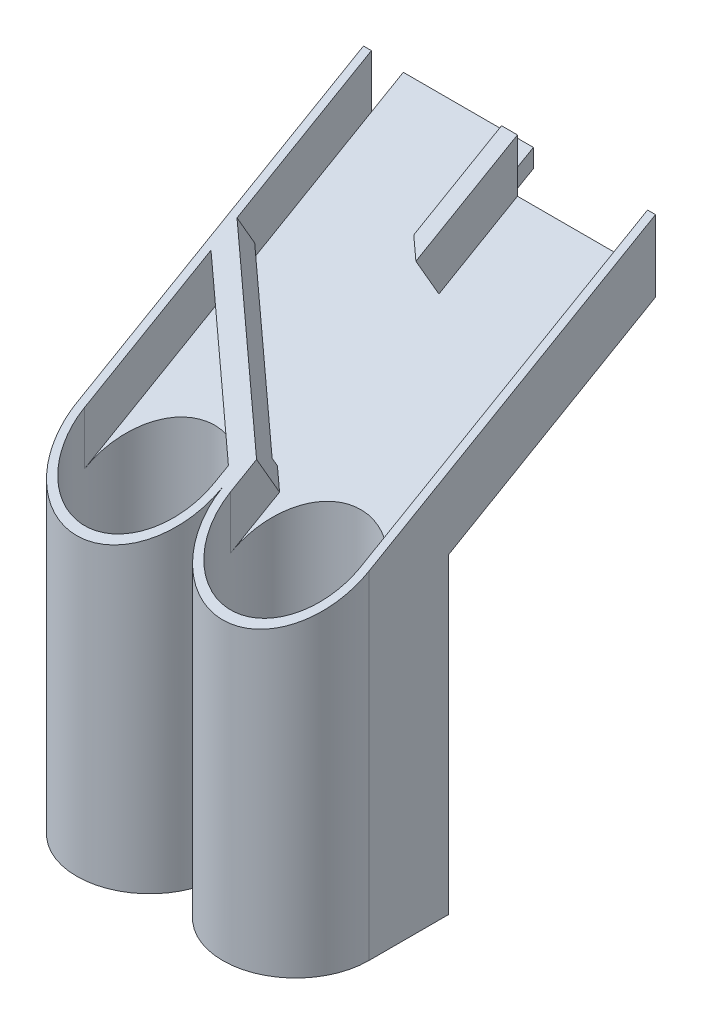
ISO-10303-21;
HEADER;
FILE_DESCRIPTION(('STEP AP214'),'2;1');
FILE_NAME('part.step','',(''),(''),'','','');
FILE_SCHEMA(('AUTOMOTIVE_DESIGN { 1 0 10303 214 1 1 1 1 }'));
ENDSEC;
DATA;
#1=APPLICATION_CONTEXT('core data for automotive mechanical design processes');
#2=APPLICATION_PROTOCOL_DEFINITION('international standard','automotive_design',2000,#1);
#3=PRODUCT_CONTEXT('',#1,'mechanical');
#4=PRODUCT('Part','Part','',(#3));
#5=PRODUCT_RELATED_PRODUCT_CATEGORY('part','',(#4));
#6=PRODUCT_DEFINITION_FORMATION('','',#4);
#7=PRODUCT_DEFINITION_CONTEXT('part definition',#1,'design');
#8=PRODUCT_DEFINITION('design','',#6,#7);
#9=PRODUCT_DEFINITION_SHAPE('','',#8);
#10=(LENGTH_UNIT() NAMED_UNIT(*) SI_UNIT(.MILLI.,.METRE.));
#11=(NAMED_UNIT(*) PLANE_ANGLE_UNIT() SI_UNIT($,.RADIAN.));
#12=(NAMED_UNIT(*) SI_UNIT($,.STERADIAN.) SOLID_ANGLE_UNIT());
#13=UNCERTAINTY_MEASURE_WITH_UNIT(LENGTH_MEASURE(1.E-05),#10,'distance_accuracy_value','');
#14=(GEOMETRIC_REPRESENTATION_CONTEXT(3) GLOBAL_UNCERTAINTY_ASSIGNED_CONTEXT((#13)) GLOBAL_UNIT_ASSIGNED_CONTEXT((#10,
#11,#12)) REPRESENTATION_CONTEXT('',''));
#15=CARTESIAN_POINT('',(0.,0.,0.));
#16=DIRECTION('',(0.,0.,1.));
#17=DIRECTION('',(1.,0.,0.));
#18=AXIS2_PLACEMENT_3D('',#15,#16,#17);
#19=CARTESIAN_POINT('',(0.,300.,0.));
#20=DIRECTION('',(0.,-1.,0.));
#21=DIRECTION('',(0.,0.,-1.));
#22=AXIS2_PLACEMENT_3D('',#19,#20,#21);
#23=CYLINDRICAL_SURFACE('',#22,24.5);
#24=CARTESIAN_POINT('',(0.,230.717967697246,0.));
#25=DIRECTION('',(0.,-0.866025403784442,-0.499999999999995));
#26=DIRECTION('',(0.,-0.499999999999995,0.866025403784442));
#27=AXIS2_PLACEMENT_3D('',#24,#25,#26);
#28=ELLIPSE('',#27,28.2901631902916,24.5);
#29=CARTESIAN_POINT('',(24.5,230.717967697246,0.));
#30=VERTEX_POINT('',#29);
#31=CARTESIAN_POINT('',(-24.5,230.717967697246,0.));
#32=VERTEX_POINT('',#31);
#33=EDGE_CURVE('E407',#30,#32,#28,.F.);
#34=ORIENTED_EDGE('',*,*,#33,.T.);
#35=DIRECTION('',(0.,-1.,0.));
#36=VECTOR('',#35,1.);
#37=CARTESIAN_POINT('',(-24.5,250.717967697253,-1.20181642415673E-11));
#38=LINE('',#37,#36);
#39=CARTESIAN_POINT('',(-24.5,250.717967697253,-1.20181642415673E-11));
#40=VERTEX_POINT('',#39);
#41=EDGE_CURVE('E390',#40,#32,#38,.T.);
#42=ORIENTED_EDGE('',*,*,#41,.F.);
#43=CARTESIAN_POINT('',(24.5,250.717967697274,0.));
#44=CARTESIAN_POINT('',(24.5,222.427804506982,49.));
#45=CARTESIAN_POINT('',(-24.5,222.427804506982,49.));
#46=CARTESIAN_POINT('',(-24.5,250.717967697274,0.));
#47=(BOUNDED_CURVE() B_SPLINE_CURVE(3,(#43,#44,#45,#46),.UNSPECIFIED.,.F.,
.F.) B_SPLINE_CURVE_WITH_KNOTS((4,4),(0.,1.),
.UNSPECIFIED.) CURVE() GEOMETRIC_REPRESENTATION_ITEM() RATIONAL_B_SPLINE_CURVE((1.,
0.333333333333333,0.333333333333333,1.)) REPRESENTATION_ITEM(''));
#48=CARTESIAN_POINT('',(24.5,250.717967697274,0.));
#49=VERTEX_POINT('',#48);
#50=EDGE_CURVE('E380',#49,#40,#47,.T.);
#51=ORIENTED_EDGE('',*,*,#50,.F.);
#52=DIRECTION('',(0.,-1.,0.));
#53=VECTOR('',#52,1.);
#54=CARTESIAN_POINT('',(24.5,250.717967697274,0.));
#55=LINE('',#54,#53);
#56=EDGE_CURVE('E398',#49,#30,#55,.T.);
#57=ORIENTED_EDGE('',*,*,#56,.T.);
#58=EDGE_LOOP('',(#34,#42,#51,#57));
#59=FACE_BOUND('',#58,.T.);
#60=CARTESIAN_POINT('',(0.,167.717967697246,0.));
#61=DIRECTION('',(0.,-1.,0.));
#62=DIRECTION('',(0.,0.,-1.));
#63=AXIS2_PLACEMENT_3D('',#60,#61,#62);
#64=CIRCLE('',#63,24.5);
#65=CARTESIAN_POINT('',(0.,167.717967697246,-24.5));
#66=VERTEX_POINT('',#65);
#67=EDGE_CURVE('E243',#66,#66,#64,.T.);
#68=ORIENTED_EDGE('',*,*,#67,.T.);
#69=EDGE_LOOP('',(#68));
#70=FACE_BOUND('',#69,.T.);
#71=ADVANCED_FACE('F36',(#59,#70),#23,.F.);
#72=CARTESIAN_POINT('',(24.5,320.,-120.));
#73=DIRECTION('',(1.,0.,0.));
#74=DIRECTION('',(0.,0.,-1.));
#75=AXIS2_PLACEMENT_3D('',#72,#73,#74);
#76=PLANE('',#75);
#77=DIRECTION('',(0.,0.499999999999995,-0.866025403784442));
#78=VECTOR('',#77,1.);
#79=CARTESIAN_POINT('',(24.5,242.147344788948,-11.7962618216929));
#80=LINE('',#79,#78);
#81=CARTESIAN_POINT('',(24.5,242.147344788948,-11.7962618216929));
#82=VERTEX_POINT('',#81);
#83=CARTESIAN_POINT('',(24.5,247.804199038441,-21.5942207928257));
#84=VERTEX_POINT('',#83);
#85=EDGE_CURVE('E271',#82,#84,#80,.T.);
#86=ORIENTED_EDGE('',*,*,#85,.T.);
#87=DIRECTION('',(0.,0.866025403784442,0.499999999999995));
#88=VECTOR('',#87,1.);
#89=CARTESIAN_POINT('',(24.5,178.924746159196,-61.3617914542915));
#90=LINE('',#89,#88);
#91=CARTESIAN_POINT('',(24.5,244.340097423303,-23.5942207928257));
#92=VERTEX_POINT('',#91);
#93=EDGE_CURVE('E264',#92,#84,#90,.T.);
#94=ORIENTED_EDGE('',*,*,#93,.F.);
#95=DIRECTION('',(0.,-0.499999999999995,0.866025403784442));
#96=VECTOR('',#95,1.);
#97=CARTESIAN_POINT('',(24.5,300.,-120.));
#98=LINE('',#97,#96);
#99=EDGE_CURVE('E364',#92,#30,#98,.T.);
#100=ORIENTED_EDGE('',*,*,#99,.T.);
#101=ORIENTED_EDGE('',*,*,#56,.F.);
#102=DIRECTION('',(0.,-0.499999999999995,0.866025403784442));
#103=VECTOR('',#102,1.);
#104=CARTESIAN_POINT('',(24.5,320.,-120.));
#105=LINE('',#104,#103);
#106=CARTESIAN_POINT('',(24.5,253.683243173821,-5.13600778384251));
#107=VERTEX_POINT('',#106);
#108=EDGE_CURVE('E373',#107,#49,#105,.T.);
#109=ORIENTED_EDGE('',*,*,#108,.F.);
#110=DIRECTION('',(0.,0.866025403784442,0.499999999999995));
#111=VECTOR('',#110,1.);
#112=CARTESIAN_POINT('',(24.5,171.384969981436,-52.6509379653067));
#113=LINE('',#112,#111);
#114=EDGE_CURVE('E279',#82,#107,#113,.T.);
#115=ORIENTED_EDGE('',*,*,#114,.F.);
#116=EDGE_LOOP('',(#86,#94,#100,#101,#109,#115));
#117=FACE_BOUND('',#116,.T.);
#118=ADVANCED_FACE('F499',(#117),#76,.F.);
#119=CARTESIAN_POINT('',(0.,234.840835294559,27.5));
#120=DIRECTION('',(0.,0.866025403784442,0.499999999999995));
#121=DIRECTION('',(0.,-0.499999999999995,0.866025403784442));
#122=AXIS2_PLACEMENT_3D('',#119,#120,#121);
#123=PLANE('',#122);
#124=DIRECTION('',(0.,-0.499999999999995,0.866025403784442));
#125=VECTOR('',#124,1.);
#126=CARTESIAN_POINT('',(30.5,320.,-120.));
#127=LINE('',#126,#125);
#128=CARTESIAN_POINT('',(30.5,256.340097423324,-9.73781433226267));
#129=VERTEX_POINT('',#128);
#130=CARTESIAN_POINT('',(30.5,250.717967697274,0.));
#131=VERTEX_POINT('',#130);
#132=EDGE_CURVE('E310',#129,#131,#127,.T.);
#133=ORIENTED_EDGE('',*,*,#132,.F.);
#134=DIRECTION('',(-0.707106781186544,0.353553390593272,-0.6123724356958));
#135=VECTOR('',#134,1.);
#136=CARTESIAN_POINT('',(-24.5,283.840097423324,-57.3692115404074));
#137=LINE('',#136,#135);
#138=CARTESIAN_POINT('',(-24.5,283.840097423303,-57.3692115404193));
#139=VERTEX_POINT('',#138);
#140=EDGE_CURVE('E269',#129,#139,#137,.T.);
#141=ORIENTED_EDGE('',*,*,#140,.T.);
#142=DIRECTION('',(0.,0.499999999999995,-0.866025403784442));
#143=VECTOR('',#142,1.);
#144=CARTESIAN_POINT('',(-24.5,320.,-120.));
#145=LINE('',#144,#143);
#146=CARTESIAN_POINT('',(-24.5,313.071796769752,-108.));
#147=VERTEX_POINT('',#146);
#148=EDGE_CURVE('E384',#139,#147,#145,.T.);
#149=ORIENTED_EDGE('',*,*,#148,.T.);
#150=DIRECTION('',(-1.,0.,0.));
#151=VECTOR('',#150,1.);
#152=CARTESIAN_POINT('',(0.,313.071796769752,-108.));
#153=LINE('',#152,#151);
#154=CARTESIAN_POINT('',(-27.5,313.071796769732,-108.000000000012));
#155=VERTEX_POINT('',#154);
#156=EDGE_CURVE('E44',#147,#155,#153,.T.);
#157=ORIENTED_EDGE('',*,*,#156,.T.);
#158=DIRECTION('',(0.,-0.499999999999995,0.866025403784442));
#159=VECTOR('',#158,1.);
#160=CARTESIAN_POINT('',(-27.5,320.,-120.));
#161=LINE('',#160,#159);
#162=CARTESIAN_POINT('',(-27.5,250.717967697274,0.));
#163=VERTEX_POINT('',#162);
#164=EDGE_CURVE('E365',#155,#163,#161,.T.);
#165=ORIENTED_EDGE('',*,*,#164,.T.);
#166=CARTESIAN_POINT('',(27.5,250.717967697274,0.));
#167=CARTESIAN_POINT('',(27.5,218.963702891845,55.));
#168=CARTESIAN_POINT('',(-27.5,218.963702891845,55.));
#169=CARTESIAN_POINT('',(-27.5,250.717967697274,0.));
#170=(BOUNDED_CURVE() B_SPLINE_CURVE(3,(#166,#167,#168,#169),.UNSPECIFIED.,.F.,
.F.) B_SPLINE_CURVE_WITH_KNOTS((4,4),(0.,1.),
.UNSPECIFIED.) CURVE() GEOMETRIC_REPRESENTATION_ITEM() RATIONAL_B_SPLINE_CURVE((1.,
0.333333333333333,0.333333333333333,1.)) REPRESENTATION_ITEM(''));
#171=CARTESIAN_POINT('',(27.5,250.717967697253,-1.20597976049908E-11));
#172=VERTEX_POINT('',#171);
#173=EDGE_CURVE('E367',#172,#163,#170,.T.);
#174=ORIENTED_EDGE('',*,*,#173,.F.);
#175=CARTESIAN_POINT('',(27.5,250.717967697274,0.));
#176=CARTESIAN_POINT('',(27.5,218.963702891845,55.));
#177=CARTESIAN_POINT('',(82.5,218.963702891845,55.));
#178=CARTESIAN_POINT('',(82.5,250.717967697274,0.));
#179=(BOUNDED_CURVE() B_SPLINE_CURVE(3,(#175,#176,#177,#178),.UNSPECIFIED.,.F.,
.F.) B_SPLINE_CURVE_WITH_KNOTS((4,4),(0.,1.),
.UNSPECIFIED.) CURVE() GEOMETRIC_REPRESENTATION_ITEM() RATIONAL_B_SPLINE_CURVE((1.,
0.333333333333333,0.333333333333333,1.)) REPRESENTATION_ITEM(''));
#180=CARTESIAN_POINT('',(82.5,250.717967697274,0.));
#181=VERTEX_POINT('',#180);
#182=EDGE_CURVE('E305',#172,#181,#179,.T.);
#183=ORIENTED_EDGE('',*,*,#182,.T.);
#184=DIRECTION('',(0.,-0.499999999999995,0.866025403784442));
#185=VECTOR('',#184,1.);
#186=CARTESIAN_POINT('',(82.5,320.,-120.));
#187=LINE('',#186,#185);
#188=CARTESIAN_POINT('',(82.5,313.071796769732,-108.000000000012));
#189=VERTEX_POINT('',#188);
#190=EDGE_CURVE('E302',#189,#181,#187,.T.);
#191=ORIENTED_EDGE('',*,*,#190,.F.);
#192=DIRECTION('',(1.,0.,0.));
#193=VECTOR('',#192,1.);
#194=CARTESIAN_POINT('',(55.,313.071796769752,-108.));
#195=LINE('',#194,#193);
#196=CARTESIAN_POINT('',(79.5,313.071796769752,-108.));
#197=VERTEX_POINT('',#196);
#198=EDGE_CURVE('E345',#197,#189,#195,.T.);
#199=ORIENTED_EDGE('',*,*,#198,.F.);
#200=DIRECTION('',(0.,0.499999999999995,-0.866025403784442));
#201=VECTOR('',#200,1.);
#202=CARTESIAN_POINT('',(79.5,320.,-120.));
#203=LINE('',#202,#201);
#204=CARTESIAN_POINT('',(79.5,250.717967697253,-1.20181642415673E-11));
#205=VERTEX_POINT('',#204);
#206=EDGE_CURVE('E321',#205,#197,#203,.T.);
#207=ORIENTED_EDGE('',*,*,#206,.F.);
#208=CARTESIAN_POINT('',(30.5,250.717967697274,0.));
#209=CARTESIAN_POINT('',(30.5,222.427804506982,49.));
#210=CARTESIAN_POINT('',(79.5,222.427804506982,49.));
#211=CARTESIAN_POINT('',(79.5,250.717967697274,0.));
#212=(BOUNDED_CURVE() B_SPLINE_CURVE(3,(#208,#209,#210,#211),.UNSPECIFIED.,.F.,
.F.) B_SPLINE_CURVE_WITH_KNOTS((4,4),(0.,1.),
.UNSPECIFIED.) CURVE() GEOMETRIC_REPRESENTATION_ITEM() RATIONAL_B_SPLINE_CURVE((1.,
0.333333333333333,0.333333333333333,1.)) REPRESENTATION_ITEM(''));
#213=EDGE_CURVE('E317',#131,#205,#212,.T.);
#214=ORIENTED_EDGE('',*,*,#213,.F.);
#215=EDGE_LOOP('',(#133,#141,#149,#157,#165,#174,#183,#191,#199,#207,#214));
#216=FACE_BOUND('',#215,.T.);
#217=CARTESIAN_POINT('',(-24.5,278.183243173832,-47.5712525692746));
#218=VERTEX_POINT('',#217);
#219=EDGE_CURVE('E385',#40,#218,#145,.T.);
#220=ORIENTED_EDGE('',*,*,#219,.T.);
#221=DIRECTION('',(0.707106781186544,-0.353553390593273,0.6123724356958));
#222=VECTOR('',#221,1.);
#223=CARTESIAN_POINT('',(-24.5,278.183243173832,-47.5712525692746));
#224=LINE('',#223,#222);
#225=EDGE_CURVE('E59',#218,#107,#224,.T.);
#226=ORIENTED_EDGE('',*,*,#225,.T.);
#227=ORIENTED_EDGE('',*,*,#108,.T.);
#228=ORIENTED_EDGE('',*,*,#50,.T.);
#229=EDGE_LOOP('',(#220,#226,#227,#228));
#230=FACE_BOUND('',#229,.T.);
#231=ADVANCED_FACE('F416',(#216,#230),#123,.T.);
#232=CARTESIAN_POINT('',(30.5,320.,-120.));
#233=DIRECTION('',(-1.,0.,0.));
#234=DIRECTION('',(0.,0.,-1.));
#235=AXIS2_PLACEMENT_3D('',#232,#233,#234);
#236=PLANE('',#235);
#237=DIRECTION('',(0.,-0.499999999999995,0.866025403784442));
#238=VECTOR('',#237,1.);
#239=CARTESIAN_POINT('',(30.5,300.,-120.));
#240=LINE('',#239,#238);
#241=CARTESIAN_POINT('',(30.5,241.340097423303,-18.3980683701191));
#242=VERTEX_POINT('',#241);
#243=CARTESIAN_POINT('',(30.5,230.717967697246,0.));
#244=VERTEX_POINT('',#243);
#245=EDGE_CURVE('E299',#242,#244,#240,.T.);
#246=ORIENTED_EDGE('',*,*,#245,.F.);
#247=DIRECTION('',(0.,0.866025403784442,0.499999999999995));
#248=VECTOR('',#247,1.);
#249=CARTESIAN_POINT('',(30.5,175.924746159196,-56.1656390315849));
#250=LINE('',#249,#248);
#251=EDGE_CURVE('E256',#242,#129,#250,.T.);
#252=ORIENTED_EDGE('',*,*,#251,.T.);
#253=ORIENTED_EDGE('',*,*,#132,.T.);
#254=DIRECTION('',(0.,-1.,0.));
#255=VECTOR('',#254,1.);
#256=CARTESIAN_POINT('',(30.5,250.717967697274,0.));
#257=LINE('',#256,#255);
#258=EDGE_CURVE('E334',#131,#244,#257,.T.);
#259=ORIENTED_EDGE('',*,*,#258,.T.);
#260=EDGE_LOOP('',(#246,#252,#253,#259));
#261=FACE_BOUND('',#260,.T.);
#262=ADVANCED_FACE('F456',(#261),#236,.F.);
#263=CARTESIAN_POINT('',(-27.5,300.,-120.));
#264=DIRECTION('',(0.,0.,1.));
#265=DIRECTION('',(1.,0.,0.));
#266=AXIS2_PLACEMENT_3D('',#263,#264,#265);
#267=PLANE('',#266);
#268=DIRECTION('',(0.,-1.,0.));
#269=VECTOR('',#268,1.);
#270=CARTESIAN_POINT('',(24.5,320.,-120.));
#271=LINE('',#270,#269);
#272=CARTESIAN_POINT('',(24.5,300.,-120.));
#273=VERTEX_POINT('',#272);
#274=CARTESIAN_POINT('',(24.5,293.071796769724,-120.));
#275=VERTEX_POINT('',#274);
#276=EDGE_CURVE('E352',#273,#275,#271,.T.);
#277=ORIENTED_EDGE('',*,*,#276,.T.);
#278=DIRECTION('',(1.,0.,0.));
#279=VECTOR('',#278,1.);
#280=CARTESIAN_POINT('',(-27.5,293.071796769724,-120.));
#281=LINE('',#280,#279);
#282=CARTESIAN_POINT('',(-24.5,293.071796769724,-120.));
#283=VERTEX_POINT('',#282);
#284=EDGE_CURVE('E211',#283,#275,#281,.T.);
#285=ORIENTED_EDGE('',*,*,#284,.F.);
#286=DIRECTION('',(0.,-1.,0.));
#287=VECTOR('',#286,1.);
#288=CARTESIAN_POINT('',(-24.5,320.,-120.));
#289=LINE('',#288,#287);
#290=CARTESIAN_POINT('',(-24.5,300.,-120.));
#291=VERTEX_POINT('',#290);
#292=EDGE_CURVE('E348',#291,#283,#289,.T.);
#293=ORIENTED_EDGE('',*,*,#292,.F.);
#294=DIRECTION('',(-1.,0.,0.));
#295=VECTOR('',#294,1.);
#296=CARTESIAN_POINT('',(-27.5,300.,-120.));
#297=LINE('',#296,#295);
#298=EDGE_CURVE('E401',#273,#291,#297,.T.);
#299=ORIENTED_EDGE('',*,*,#298,.F.);
#300=EDGE_LOOP('',(#277,#285,#293,#299));
#301=FACE_BOUND('',#300,.T.);
#302=ADVANCED_FACE('F487',(#301),#267,.F.);
#303=CARTESIAN_POINT('',(-27.5,300.,0.));
#304=DIRECTION('',(1.,0.,0.));
#305=DIRECTION('',(0.,0.,-1.));
#306=AXIS2_PLACEMENT_3D('',#303,#304,#305);
#307=PLANE('',#306);
#308=DIRECTION('',(0.,-0.5,0.866025403784438));
#309=VECTOR('',#308,1.);
#310=CARTESIAN_POINT('',(-27.5,241.110272542658,-30.));
#311=LINE('',#310,#309);
#312=CARTESIAN_POINT('',(-27.5,286.143593539449,-108.));
#313=VERTEX_POINT('',#312);
#314=CARTESIAN_POINT('',(-27.5,241.110272542658,-30.));
#315=VERTEX_POINT('',#314);
#316=EDGE_CURVE('E206',#313,#315,#311,.T.);
#317=ORIENTED_EDGE('',*,*,#316,.T.);
#318=DIRECTION('',(0.,-1.,0.));
#319=VECTOR('',#318,1.);
#320=CARTESIAN_POINT('',(-27.5,123.717967697246,-30.));
#321=LINE('',#320,#319);
#322=CARTESIAN_POINT('',(-27.5,123.717967697246,-30.));
#323=VERTEX_POINT('',#322);
#324=EDGE_CURVE('E214',#315,#323,#321,.T.);
#325=ORIENTED_EDGE('',*,*,#324,.T.);
#326=DIRECTION('',(0.,0.,-1.));
#327=VECTOR('',#326,1.);
#328=CARTESIAN_POINT('',(-27.5,123.717967697246,0.));
#329=LINE('',#328,#327);
#330=CARTESIAN_POINT('',(-27.5,123.717967697246,0.));
#331=VERTEX_POINT('',#330);
#332=EDGE_CURVE('E241',#331,#323,#329,.T.);
#333=ORIENTED_EDGE('',*,*,#332,.F.);
#334=DIRECTION('',(0.,-1.,0.));
#335=VECTOR('',#334,1.);
#336=CARTESIAN_POINT('',(-27.5,300.,0.));
#337=LINE('',#336,#335);
#338=EDGE_CURVE('E404',#163,#331,#337,.T.);
#339=ORIENTED_EDGE('',*,*,#338,.F.);
#340=ORIENTED_EDGE('',*,*,#164,.F.);
#341=DIRECTION('',(0.,-1.,0.));
#342=VECTOR('',#341,1.);
#343=CARTESIAN_POINT('',(-27.5,320.,-108.));
#344=LINE('',#343,#342);
#345=EDGE_CURVE('E223',#155,#313,#344,.T.);
#346=ORIENTED_EDGE('',*,*,#345,.T.);
#347=EDGE_LOOP('',(#317,#325,#333,#339,#340,#346));
#348=FACE_BOUND('',#347,.T.);
#349=ADVANCED_FACE('F221',(#348),#307,.F.);
#350=CARTESIAN_POINT('',(24.5,293.071796769725,-108.));
#351=VERTEX_POINT('',#350);
#352=CARTESIAN_POINT('',(24.5,278.988329701443,-83.6067194910137));
#353=VERTEX_POINT('',#352);
#354=EDGE_CURVE('E393',#351,#353,#98,.T.);
#355=ORIENTED_EDGE('',*,*,#354,.T.);
#356=DIRECTION('',(0.,0.866025403784442,0.499999999999995));
#357=VECTOR('',#356,1.);
#358=CARTESIAN_POINT('',(24.5,213.572978437336,-121.37429015248));
#359=LINE('',#358,#357);
#360=CARTESIAN_POINT('',(24.5,293.988329701464,-74.9464654531573));
#361=VERTEX_POINT('',#360);
#362=EDGE_CURVE('E260',#353,#361,#359,.T.);
#363=ORIENTED_EDGE('',*,*,#362,.T.);
#364=CARTESIAN_POINT('',(24.5,313.071796769732,-108.000000000012));
#365=VERTEX_POINT('',#364);
#366=EDGE_CURVE('E374',#365,#361,#105,.T.);
#367=ORIENTED_EDGE('',*,*,#366,.F.);
#368=DIRECTION('',(0.,-1.,0.));
#369=VECTOR('',#368,1.);
#370=CARTESIAN_POINT('',(24.5,320.,-108.));
#371=LINE('',#370,#369);
#372=EDGE_CURVE('E360',#365,#351,#371,.T.);
#373=ORIENTED_EDGE('',*,*,#372,.T.);
#374=EDGE_LOOP('',(#355,#363,#367,#373));
#375=FACE_BOUND('',#374,.T.);
#376=ADVANCED_FACE('F468',(#375),#76,.F.);
#377=CARTESIAN_POINT('',(-24.5,320.,-120.));
#378=DIRECTION('',(-1.,0.,0.));
#379=DIRECTION('',(0.,0.,1.));
#380=AXIS2_PLACEMENT_3D('',#377,#378,#379);
#381=PLANE('',#380);
#382=ORIENTED_EDGE('',*,*,#148,.F.);
#383=DIRECTION('',(0.,0.866025403784442,0.499999999999995));
#384=VECTOR('',#383,1.);
#385=CARTESIAN_POINT('',(-24.5,201.541824230929,-104.884141721878));
#386=LINE('',#385,#384);
#387=CARTESIAN_POINT('',(-24.5,272.304199038441,-64.0294655782638));
#388=VERTEX_POINT('',#387);
#389=EDGE_CURVE('E284',#388,#139,#386,.T.);
#390=ORIENTED_EDGE('',*,*,#389,.F.);
#391=DIRECTION('',(0.,-0.499999999999995,0.866025403784442));
#392=VECTOR('',#391,1.);
#393=CARTESIAN_POINT('',(-24.5,272.304199038441,-64.0294655782638));
#394=LINE('',#393,#392);
#395=CARTESIAN_POINT('',(-24.5,266.647344788948,-54.231506607131));
#396=VERTEX_POINT('',#395);
#397=EDGE_CURVE('E281',#388,#396,#394,.T.);
#398=ORIENTED_EDGE('',*,*,#397,.T.);
#399=DIRECTION('',(0.,0.866025403784442,0.499999999999995));
#400=VECTOR('',#399,1.);
#401=CARTESIAN_POINT('',(-24.5,195.884969981436,-95.0861827507448));
#402=LINE('',#401,#400);
#403=EDGE_CURVE('E280',#396,#218,#402,.T.);
#404=ORIENTED_EDGE('',*,*,#403,.T.);
#405=ORIENTED_EDGE('',*,*,#219,.F.);
#406=ORIENTED_EDGE('',*,*,#41,.T.);
#407=DIRECTION('',(0.,0.499999999999995,-0.866025403784442));
#408=VECTOR('',#407,1.);
#409=CARTESIAN_POINT('',(-24.5,300.,-120.));
#410=LINE('',#409,#408);
#411=CARTESIAN_POINT('',(-24.5,293.071796769725,-108.));
#412=VERTEX_POINT('',#411);
#413=EDGE_CURVE('E368',#32,#412,#410,.T.);
#414=ORIENTED_EDGE('',*,*,#413,.T.);
#415=DIRECTION('',(0.,-1.,0.));
#416=VECTOR('',#415,1.);
#417=CARTESIAN_POINT('',(-24.5,320.,-108.));
#418=LINE('',#417,#416);
#419=EDGE_CURVE('E355',#147,#412,#418,.T.);
#420=ORIENTED_EDGE('',*,*,#419,.F.);
#421=EDGE_LOOP('',(#382,#390,#398,#404,#405,#406,#414,#420));
#422=FACE_BOUND('',#421,.T.);
#423=ADVANCED_FACE('F492',(#422),#381,.F.);
#424=DIRECTION('',(-0.707106781186548,0.353553390593275,-0.612372435695793));
#425=VECTOR('',#424,1.);
#426=CARTESIAN_POINT('',(30.5,290.988329701464,-69.7503130304507));
#427=LINE('',#426,#425);
#428=CARTESIAN_POINT('',(30.5,290.988329701464,-69.7503130304507));
#429=VERTEX_POINT('',#428);
#430=EDGE_CURVE('E251',#429,#361,#427,.T.);
#431=ORIENTED_EDGE('',*,*,#430,.F.);
#432=CARTESIAN_POINT('',(30.5,313.071796769732,-108.000000000012));
#433=VERTEX_POINT('',#432);
#434=EDGE_CURVE('E311',#433,#429,#127,.T.);
#435=ORIENTED_EDGE('',*,*,#434,.F.);
#436=DIRECTION('',(-1.,0.,0.));
#437=VECTOR('',#436,1.);
#438=CARTESIAN_POINT('',(0.,313.071796769752,-108.));
#439=LINE('',#438,#437);
#440=EDGE_CURVE('E410',#433,#365,#439,.T.);
#441=ORIENTED_EDGE('',*,*,#440,.T.);
#442=ORIENTED_EDGE('',*,*,#366,.T.);
#443=EDGE_LOOP('',(#431,#435,#441,#442));
#444=FACE_BOUND('',#443,.T.);
#445=ADVANCED_FACE('F480',(#444),#123,.T.);
#446=CARTESIAN_POINT('',(-27.5,300.,-120.));
#447=DIRECTION('',(0.,-0.866025403784442,-0.499999999999995));
#448=DIRECTION('',(0.,0.499999999999995,-0.866025403784442));
#449=AXIS2_PLACEMENT_3D('',#446,#447,#448);
#450=PLANE('',#449);
#451=DIRECTION('',(0.,0.499999999999995,-0.866025403784442));
#452=VECTOR('',#451,1.);
#453=CARTESIAN_POINT('',(79.5,300.,-120.));
#454=LINE('',#453,#452);
#455=CARTESIAN_POINT('',(79.5,230.717967697246,0.));
#456=VERTEX_POINT('',#455);
#457=CARTESIAN_POINT('',(79.5,293.071796769725,-108.));
#458=VERTEX_POINT('',#457);
#459=EDGE_CURVE('E306',#456,#458,#454,.T.);
#460=ORIENTED_EDGE('',*,*,#459,.T.);
#461=DIRECTION('',(-1.,0.,0.));
#462=VECTOR('',#461,1.);
#463=CARTESIAN_POINT('',(-27.5,293.071796769725,-108.));
#464=LINE('',#463,#462);
#465=CARTESIAN_POINT('',(30.5,293.071796769725,-108.));
#466=VERTEX_POINT('',#465);
#467=EDGE_CURVE('E238',#458,#466,#464,.T.);
#468=ORIENTED_EDGE('',*,*,#467,.T.);
#469=CARTESIAN_POINT('',(30.5,275.988329701444,-78.4105670683071));
#470=VERTEX_POINT('',#469);
#471=EDGE_CURVE('E329',#466,#470,#240,.T.);
#472=ORIENTED_EDGE('',*,*,#471,.T.);
#473=DIRECTION('',(-0.707106781186548,0.35355339059327,-0.612372435695796));
#474=VECTOR('',#473,1.);
#475=CARTESIAN_POINT('',(30.5,275.988329701444,-78.4105670683071));
#476=LINE('',#475,#474);
#477=EDGE_CURVE('E257',#470,#353,#476,.T.);
#478=ORIENTED_EDGE('',*,*,#477,.T.);
#479=ORIENTED_EDGE('',*,*,#354,.F.);
#480=EDGE_CURVE('E391',#273,#351,#98,.T.);
#481=ORIENTED_EDGE('',*,*,#480,.F.);
#482=ORIENTED_EDGE('',*,*,#298,.T.);
#483=DIRECTION('',(0.,0.499999999999995,-0.866025403784442));
#484=VECTOR('',#483,1.);
#485=CARTESIAN_POINT('',(-24.5,300.,-120.));
#486=LINE('',#485,#484);
#487=EDGE_CURVE('E357',#412,#291,#486,.T.);
#488=ORIENTED_EDGE('',*,*,#487,.F.);
#489=ORIENTED_EDGE('',*,*,#413,.F.);
#490=ORIENTED_EDGE('',*,*,#33,.F.);
#491=ORIENTED_EDGE('',*,*,#99,.F.);
#492=DIRECTION('',(0.707106781186548,-0.35355339059327,0.612372435695796));
#493=VECTOR('',#492,1.);
#494=CARTESIAN_POINT('',(24.5,244.340097423303,-23.5942207928257));
#495=LINE('',#494,#493);
#496=EDGE_CURVE('E253',#92,#242,#495,.T.);
#497=ORIENTED_EDGE('',*,*,#496,.T.);
#498=ORIENTED_EDGE('',*,*,#245,.T.);
#499=CARTESIAN_POINT('',(55.,230.717967697246,0.));
#500=DIRECTION('',(0.,0.866025403784442,0.499999999999995));
#501=DIRECTION('',(0.,-0.499999999999995,0.866025403784442));
#502=AXIS2_PLACEMENT_3D('',#499,#500,#501);
#503=ELLIPSE('',#502,28.2901631902916,24.5);
#504=EDGE_CURVE('E343',#244,#456,#503,.F.);
#505=ORIENTED_EDGE('',*,*,#504,.T.);
#506=EDGE_LOOP('',(#460,#468,#472,#478,#479,#481,#482,#488,#489,#490,#491,#497,#498,#505));
#507=FACE_BOUND('',#506,.T.);
#508=ADVANCED_FACE('F449',(#507),#450,.F.);
#509=CARTESIAN_POINT('',(0.,300.,0.));
#510=DIRECTION('',(0.,-1.,0.));
#511=DIRECTION('',(0.,0.,-1.));
#512=AXIS2_PLACEMENT_3D('',#509,#510,#511);
#513=CYLINDRICAL_SURFACE('',#512,27.5);
#514=ORIENTED_EDGE('',*,*,#338,.T.);
#515=CARTESIAN_POINT('',(0.,123.717967697246,0.));
#516=DIRECTION('',(0.,1.,0.));
#517=DIRECTION('',(0.,0.,1.));
#518=AXIS2_PLACEMENT_3D('',#515,#516,#517);
#519=CIRCLE('',#518,27.5);
#520=CARTESIAN_POINT('',(27.5,123.717967697246,0.));
#521=VERTEX_POINT('',#520);
#522=EDGE_CURVE('E244',#521,#331,#519,.F.);
#523=ORIENTED_EDGE('',*,*,#522,.F.);
#524=DIRECTION('',(0.,-1.,0.));
#525=VECTOR('',#524,1.);
#526=CARTESIAN_POINT('',(27.5,300.,0.));
#527=LINE('',#526,#525);
#528=EDGE_CURVE('E340',#172,#521,#527,.T.);
#529=ORIENTED_EDGE('',*,*,#528,.F.);
#530=ORIENTED_EDGE('',*,*,#173,.T.);
#531=EDGE_LOOP('',(#514,#523,#529,#530));
#532=FACE_BOUND('',#531,.T.);
#533=ADVANCED_FACE('F38',(#532),#513,.T.);
#534=CARTESIAN_POINT('',(24.5,320.,-120.));
#535=DIRECTION('',(1.,0.,0.));
#536=DIRECTION('',(0.,0.,-1.));
#537=AXIS2_PLACEMENT_3D('',#534,#535,#536);
#538=PLANE('',#537);
#539=DIRECTION('',(0.,-0.5,0.866025403784439));
#540=VECTOR('',#539,1.);
#541=CARTESIAN_POINT('',(24.5,299.803847577293,-131.660254037844));
#542=LINE('',#541,#540);
#543=CARTESIAN_POINT('',(24.5,286.143593539449,-108.));
#544=VERTEX_POINT('',#543);
#545=EDGE_CURVE('E236',#275,#544,#542,.T.);
#546=ORIENTED_EDGE('',*,*,#545,.F.);
#547=ORIENTED_EDGE('',*,*,#276,.F.);
#548=ORIENTED_EDGE('',*,*,#480,.T.);
#549=EDGE_CURVE('E347',#351,#544,#371,.T.);
#550=ORIENTED_EDGE('',*,*,#549,.T.);
#551=EDGE_LOOP('',(#546,#547,#548,#550));
#552=FACE_BOUND('',#551,.T.);
#553=ADVANCED_FACE('F484',(#552),#538,.T.);
#554=CARTESIAN_POINT('',(24.5,320.,-108.));
#555=DIRECTION('',(0.,0.,-1.));
#556=DIRECTION('',(-1.,0.,0.));
#557=AXIS2_PLACEMENT_3D('',#554,#555,#556);
#558=PLANE('',#557);
#559=DIRECTION('',(1.,0.,0.));
#560=VECTOR('',#559,1.);
#561=CARTESIAN_POINT('',(24.5,286.143593539449,-108.));
#562=LINE('',#561,#560);
#563=CARTESIAN_POINT('',(82.5,286.143593539456,-108.000000000012));
#564=VERTEX_POINT('',#563);
#565=EDGE_CURVE('E234',#544,#564,#562,.T.);
#566=ORIENTED_EDGE('',*,*,#565,.F.);
#567=ORIENTED_EDGE('',*,*,#549,.F.);
#568=ORIENTED_EDGE('',*,*,#372,.F.);
#569=ORIENTED_EDGE('',*,*,#440,.F.);
#570=DIRECTION('',(0.,-1.,0.));
#571=VECTOR('',#570,1.);
#572=CARTESIAN_POINT('',(30.5,320.,-108.));
#573=LINE('',#572,#571);
#574=EDGE_CURVE('E292',#433,#466,#573,.T.);
#575=ORIENTED_EDGE('',*,*,#574,.T.);
#576=ORIENTED_EDGE('',*,*,#467,.F.);
#577=DIRECTION('',(0.,-1.,0.));
#578=VECTOR('',#577,1.);
#579=CARTESIAN_POINT('',(79.5,320.,-108.));
#580=LINE('',#579,#578);
#581=EDGE_CURVE('E293',#197,#458,#580,.T.);
#582=ORIENTED_EDGE('',*,*,#581,.F.);
#583=ORIENTED_EDGE('',*,*,#198,.T.);
#584=DIRECTION('',(0.,-1.,0.));
#585=VECTOR('',#584,1.);
#586=CARTESIAN_POINT('',(82.5,320.,-108.));
#587=LINE('',#586,#585);
#588=EDGE_CURVE('E296',#189,#564,#587,.T.);
#589=ORIENTED_EDGE('',*,*,#588,.T.);
#590=EDGE_LOOP('',(#566,#567,#568,#569,#575,#576,#582,#583,#589));
#591=FACE_BOUND('',#590,.T.);
#592=ADVANCED_FACE('F444',(#591),#558,.T.);
#593=CARTESIAN_POINT('',(-24.5,320.,-120.));
#594=DIRECTION('',(-1.,0.,0.));
#595=DIRECTION('',(0.,0.,1.));
#596=AXIS2_PLACEMENT_3D('',#593,#594,#595);
#597=PLANE('',#596);
#598=DIRECTION('',(0.,0.5,-0.866025403784439));
#599=VECTOR('',#598,1.);
#600=CARTESIAN_POINT('',(-24.5,299.803847577293,-131.660254037844));
#601=LINE('',#600,#599);
#602=CARTESIAN_POINT('',(-24.5,286.143593539449,-108.));
#603=VERTEX_POINT('',#602);
#604=EDGE_CURVE('E232',#603,#283,#601,.T.);
#605=ORIENTED_EDGE('',*,*,#604,.F.);
#606=EDGE_CURVE('E351',#412,#603,#418,.T.);
#607=ORIENTED_EDGE('',*,*,#606,.F.);
#608=ORIENTED_EDGE('',*,*,#487,.T.);
#609=ORIENTED_EDGE('',*,*,#292,.T.);
#610=EDGE_LOOP('',(#605,#607,#608,#609));
#611=FACE_BOUND('',#610,.T.);
#612=ADVANCED_FACE('F569',(#611),#597,.T.);
#613=CARTESIAN_POINT('',(-24.5,320.,-108.));
#614=DIRECTION('',(0.,0.,-1.));
#615=DIRECTION('',(-1.,0.,0.));
#616=AXIS2_PLACEMENT_3D('',#613,#614,#615);
#617=PLANE('',#616);
#618=DIRECTION('',(1.,0.,0.));
#619=VECTOR('',#618,1.);
#620=CARTESIAN_POINT('',(-24.5,286.143593539449,-108.));
#621=LINE('',#620,#619);
#622=EDGE_CURVE('E228',#313,#603,#621,.T.);
#623=ORIENTED_EDGE('',*,*,#622,.F.);
#624=ORIENTED_EDGE('',*,*,#345,.F.);
#625=ORIENTED_EDGE('',*,*,#156,.F.);
#626=ORIENTED_EDGE('',*,*,#419,.T.);
#627=ORIENTED_EDGE('',*,*,#606,.T.);
#628=EDGE_LOOP('',(#623,#624,#625,#626,#627));
#629=FACE_BOUND('',#628,.T.);
#630=ADVANCED_FACE('F576',(#629),#617,.T.);
#631=CARTESIAN_POINT('',(82.5,300.,0.));
#632=DIRECTION('',(-1.,0.,0.));
#633=DIRECTION('',(0.,0.,-1.));
#634=AXIS2_PLACEMENT_3D('',#631,#632,#633);
#635=PLANE('',#634);
#636=DIRECTION('',(0.,0.,1.));
#637=VECTOR('',#636,1.);
#638=CARTESIAN_POINT('',(82.5,123.717967697246,-108.));
#639=LINE('',#638,#637);
#640=CARTESIAN_POINT('',(82.5,123.717967697246,-30.));
#641=VERTEX_POINT('',#640);
#642=CARTESIAN_POINT('',(82.5,123.717967697246,0.));
#643=VERTEX_POINT('',#642);
#644=EDGE_CURVE('E240',#641,#643,#639,.T.);
#645=ORIENTED_EDGE('',*,*,#644,.F.);
#646=DIRECTION('',(0.,-1.,0.));
#647=VECTOR('',#646,1.);
#648=CARTESIAN_POINT('',(82.5,123.717967697246,-30.));
#649=LINE('',#648,#647);
#650=CARTESIAN_POINT('',(82.5,241.110272542658,-30.));
#651=VERTEX_POINT('',#650);
#652=EDGE_CURVE('E51',#651,#641,#649,.T.);
#653=ORIENTED_EDGE('',*,*,#652,.F.);
#654=DIRECTION('',(0.,-0.5,0.866025403784438));
#655=VECTOR('',#654,1.);
#656=CARTESIAN_POINT('',(82.5,241.110272542658,-30.));
#657=LINE('',#656,#655);
#658=EDGE_CURVE('E209',#564,#651,#657,.T.);
#659=ORIENTED_EDGE('',*,*,#658,.F.);
#660=ORIENTED_EDGE('',*,*,#588,.F.);
#661=ORIENTED_EDGE('',*,*,#190,.T.);
#662=DIRECTION('',(0.,-1.,0.));
#663=VECTOR('',#662,1.);
#664=CARTESIAN_POINT('',(82.5,300.,0.));
#665=LINE('',#664,#663);
#666=EDGE_CURVE('E337',#181,#643,#665,.T.);
#667=ORIENTED_EDGE('',*,*,#666,.T.);
#668=EDGE_LOOP('',(#645,#653,#659,#660,#661,#667));
#669=FACE_BOUND('',#668,.T.);
#670=ADVANCED_FACE('F434',(#669),#635,.F.);
#671=ORIENTED_EDGE('',*,*,#434,.T.);
#672=DIRECTION('',(0.,0.866025403784442,0.499999999999995));
#673=VECTOR('',#672,1.);
#674=CARTESIAN_POINT('',(30.5,210.572978437336,-116.178137729773));
#675=LINE('',#674,#673);
#676=EDGE_CURVE('E261',#470,#429,#675,.T.);
#677=ORIENTED_EDGE('',*,*,#676,.F.);
#678=ORIENTED_EDGE('',*,*,#471,.F.);
#679=ORIENTED_EDGE('',*,*,#574,.F.);
#680=EDGE_LOOP('',(#671,#677,#678,#679));
#681=FACE_BOUND('',#680,.T.);
#682=ADVANCED_FACE('F477',(#681),#236,.F.);
#683=CARTESIAN_POINT('',(79.5,320.,-120.));
#684=DIRECTION('',(1.,0.,0.));
#685=DIRECTION('',(0.,0.,1.));
#686=AXIS2_PLACEMENT_3D('',#683,#684,#685);
#687=PLANE('',#686);
#688=ORIENTED_EDGE('',*,*,#581,.T.);
#689=ORIENTED_EDGE('',*,*,#459,.F.);
#690=DIRECTION('',(0.,-1.,0.));
#691=VECTOR('',#690,1.);
#692=CARTESIAN_POINT('',(79.5,250.717967697253,-1.20181642415673E-11));
#693=LINE('',#692,#691);
#694=EDGE_CURVE('E327',#205,#456,#693,.T.);
#695=ORIENTED_EDGE('',*,*,#694,.F.);
#696=ORIENTED_EDGE('',*,*,#206,.T.);
#697=EDGE_LOOP('',(#688,#689,#695,#696));
#698=FACE_BOUND('',#697,.T.);
#699=ADVANCED_FACE('F441',(#698),#687,.F.);
#700=CARTESIAN_POINT('',(55.,300.,0.));
#701=DIRECTION('',(0.,-1.,0.));
#702=DIRECTION('',(0.,0.,-1.));
#703=AXIS2_PLACEMENT_3D('',#700,#701,#702);
#704=CYLINDRICAL_SURFACE('',#703,27.5);
#705=ORIENTED_EDGE('',*,*,#528,.T.);
#706=CARTESIAN_POINT('',(55.,123.717967697246,0.));
#707=DIRECTION('',(0.,1.,0.));
#708=DIRECTION('',(0.,0.,1.));
#709=AXIS2_PLACEMENT_3D('',#706,#707,#708);
#710=CIRCLE('',#709,27.5);
#711=EDGE_CURVE('E246',#643,#521,#710,.F.);
#712=ORIENTED_EDGE('',*,*,#711,.F.);
#713=ORIENTED_EDGE('',*,*,#666,.F.);
#714=ORIENTED_EDGE('',*,*,#182,.F.);
#715=EDGE_LOOP('',(#705,#712,#713,#714));
#716=FACE_BOUND('',#715,.T.);
#717=ADVANCED_FACE('F429',(#716),#704,.T.);
#718=CARTESIAN_POINT('',(55.,300.,0.));
#719=DIRECTION('',(0.,-1.,0.));
#720=DIRECTION('',(0.,0.,-1.));
#721=AXIS2_PLACEMENT_3D('',#718,#719,#720);
#722=CYLINDRICAL_SURFACE('',#721,24.5);
#723=CARTESIAN_POINT('',(55.,125.717967697246,0.));
#724=DIRECTION('',(0.,1.,0.));
#725=DIRECTION('',(0.,0.,1.));
#726=AXIS2_PLACEMENT_3D('',#723,#724,#725);
#727=CIRCLE('',#726,24.5);
#728=CARTESIAN_POINT('',(55.,125.717967697246,24.5));
#729=VERTEX_POINT('',#728);
#730=EDGE_CURVE('E13',#729,#729,#727,.T.);
#731=ORIENTED_EDGE('',*,*,#730,.F.);
#732=EDGE_LOOP('',(#731));
#733=FACE_BOUND('',#732,.T.);
#734=ORIENTED_EDGE('',*,*,#504,.F.);
#735=ORIENTED_EDGE('',*,*,#258,.F.);
#736=ORIENTED_EDGE('',*,*,#213,.T.);
#737=ORIENTED_EDGE('',*,*,#694,.T.);
#738=EDGE_LOOP('',(#734,#735,#736,#737));
#739=FACE_BOUND('',#738,.T.);
#740=ADVANCED_FACE('F454',(#733,#739),#722,.F.);
#741=CARTESIAN_POINT('',(-27.5,303.464101615138,-118.));
#742=DIRECTION('',(0.,-0.866025403784442,-0.499999999999995));
#743=DIRECTION('',(0.,0.499999999999995,-0.866025403784442));
#744=AXIS2_PLACEMENT_3D('',#741,#742,#743);
#745=PLANE('',#744);
#746=DIRECTION('',(0.707106781186544,-0.353553390593272,0.6123724356958));
#747=VECTOR('',#746,1.);
#748=CARTESIAN_POINT('',(-24.5,266.647344788948,-54.231506607131));
#749=LINE('',#748,#747);
#750=EDGE_CURVE('E276',#396,#82,#749,.T.);
#751=ORIENTED_EDGE('',*,*,#750,.F.);
#752=ORIENTED_EDGE('',*,*,#397,.F.);
#753=DIRECTION('',(-0.707106781186544,0.353553390593272,-0.6123724356958));
#754=VECTOR('',#753,1.);
#755=CARTESIAN_POINT('',(-24.5,272.304199038441,-64.0294655782638));
#756=LINE('',#755,#754);
#757=EDGE_CURVE('E275',#84,#388,#756,.T.);
#758=ORIENTED_EDGE('',*,*,#757,.F.);
#759=ORIENTED_EDGE('',*,*,#85,.F.);
#760=EDGE_LOOP('',(#751,#752,#758,#759));
#761=FACE_BOUND('',#760,.T.);
#762=ADVANCED_FACE('F610',(#761),#745,.T.);
#763=CARTESIAN_POINT('',(-24.5,201.541824230929,-104.884141721878));
#764=DIRECTION('',(0.707106781186551,0.353553390593268,-0.612372435695793));
#765=DIRECTION('',(-0.654653670707975,0.,-0.755928946018457));
#766=AXIS2_PLACEMENT_3D('',#763,#764,#765);
#767=PLANE('',#766);
#768=ORIENTED_EDGE('',*,*,#140,.F.);
#769=ORIENTED_EDGE('',*,*,#251,.F.);
#770=ORIENTED_EDGE('',*,*,#496,.F.);
#771=ORIENTED_EDGE('',*,*,#93,.T.);
#772=ORIENTED_EDGE('',*,*,#757,.T.);
#773=ORIENTED_EDGE('',*,*,#389,.T.);
#774=EDGE_LOOP('',(#768,#769,#770,#771,#772,#773));
#775=FACE_BOUND('',#774,.T.);
#776=ADVANCED_FACE('F458',(#775),#767,.T.);
#777=CARTESIAN_POINT('',(-24.5,195.884969981436,-95.0861827507448));
#778=DIRECTION('',(-0.707106781186552,-0.353553390593268,0.612372435695793));
#779=DIRECTION('',(0.654653670707974,0.,0.755928946018457));
#780=AXIS2_PLACEMENT_3D('',#777,#778,#779);
#781=PLANE('',#780);
#782=ORIENTED_EDGE('',*,*,#403,.F.);
#783=ORIENTED_EDGE('',*,*,#750,.T.);
#784=ORIENTED_EDGE('',*,*,#114,.T.);
#785=ORIENTED_EDGE('',*,*,#225,.F.);
#786=EDGE_LOOP('',(#782,#783,#784,#785));
#787=FACE_BOUND('',#786,.T.);
#788=ADVANCED_FACE('F625',(#787),#781,.T.);
#789=CARTESIAN_POINT('',(30.5,210.572978437336,-116.178137729773));
#790=DIRECTION('',(0.707106781186547,0.35355339059327,-0.612372435695797));
#791=DIRECTION('',(-0.654653670707979,0.,-0.755928946018453));
#792=AXIS2_PLACEMENT_3D('',#789,#790,#791);
#793=PLANE('',#792);
#794=ORIENTED_EDGE('',*,*,#676,.T.);
#795=ORIENTED_EDGE('',*,*,#430,.T.);
#796=ORIENTED_EDGE('',*,*,#362,.F.);
#797=ORIENTED_EDGE('',*,*,#477,.F.);
#798=EDGE_LOOP('',(#794,#795,#796,#797));
#799=FACE_BOUND('',#798,.T.);
#800=ADVANCED_FACE('F474',(#799),#793,.F.);
#801=CARTESIAN_POINT('',(0.,167.717967697246,0.));
#802=DIRECTION('',(0.,-1.,0.));
#803=DIRECTION('',(0.,0.,-1.));
#804=AXIS2_PLACEMENT_3D('',#801,#802,#803);
#805=PLANE('',#804);
#806=ORIENTED_EDGE('',*,*,#67,.F.);
#807=EDGE_LOOP('',(#806));
#808=FACE_BOUND('',#807,.T.);
#809=ADVANCED_FACE('F639',(#808),#805,.F.);
#810=CARTESIAN_POINT('',(55.,125.717967697246,0.));
#811=DIRECTION('',(0.,1.,0.));
#812=DIRECTION('',(0.,0.,1.));
#813=AXIS2_PLACEMENT_3D('',#810,#811,#812);
#814=PLANE('',#813);
#815=ORIENTED_EDGE('',*,*,#730,.T.);
#816=EDGE_LOOP('',(#815));
#817=FACE_BOUND('',#816,.T.);
#818=ADVANCED_FACE('F645',(#817),#814,.T.);
#819=CARTESIAN_POINT('',(55.,123.717967697246,0.));
#820=DIRECTION('',(0.,1.,0.));
#821=DIRECTION('',(0.,0.,1.));
#822=AXIS2_PLACEMENT_3D('',#819,#820,#821);
#823=PLANE('',#822);
#824=ORIENTED_EDGE('',*,*,#332,.T.);
#825=DIRECTION('',(1.,0.,0.));
#826=VECTOR('',#825,1.);
#827=CARTESIAN_POINT('',(-27.5,123.717967697246,-30.));
#828=LINE('',#827,#826);
#829=EDGE_CURVE('E210',#323,#641,#828,.T.);
#830=ORIENTED_EDGE('',*,*,#829,.T.);
#831=ORIENTED_EDGE('',*,*,#644,.T.);
#832=ORIENTED_EDGE('',*,*,#711,.T.);
#833=ORIENTED_EDGE('',*,*,#522,.T.);
#834=EDGE_LOOP('',(#824,#830,#831,#832,#833));
#835=FACE_BOUND('',#834,.T.);
#836=ADVANCED_FACE('F652',(#835),#823,.F.);
#837=CARTESIAN_POINT('',(-27.5,123.717967697246,-30.));
#838=DIRECTION('',(0.,0.,1.));
#839=DIRECTION('',(1.,0.,0.));
#840=AXIS2_PLACEMENT_3D('',#837,#838,#839);
#841=PLANE('',#840);
#842=ORIENTED_EDGE('',*,*,#652,.T.);
#843=ORIENTED_EDGE('',*,*,#829,.F.);
#844=ORIENTED_EDGE('',*,*,#324,.F.);
#845=DIRECTION('',(1.,0.,0.));
#846=VECTOR('',#845,1.);
#847=CARTESIAN_POINT('',(-27.5,241.110272542658,-30.));
#848=LINE('',#847,#846);
#849=EDGE_CURVE('E202',#315,#651,#848,.T.);
#850=ORIENTED_EDGE('',*,*,#849,.T.);
#851=EDGE_LOOP('',(#842,#843,#844,#850));
#852=FACE_BOUND('',#851,.T.);
#853=ADVANCED_FACE('F215',(#852),#841,.F.);
#854=CARTESIAN_POINT('',(-27.5,241.110272542658,-30.));
#855=DIRECTION('',(0.,0.866025403784439,0.5));
#856=DIRECTION('',(0.,-0.5,0.866025403784439));
#857=AXIS2_PLACEMENT_3D('',#854,#855,#856);
#858=PLANE('',#857);
#859=ORIENTED_EDGE('',*,*,#545,.T.);
#860=ORIENTED_EDGE('',*,*,#565,.T.);
#861=ORIENTED_EDGE('',*,*,#658,.T.);
#862=ORIENTED_EDGE('',*,*,#849,.F.);
#863=ORIENTED_EDGE('',*,*,#316,.F.);
#864=ORIENTED_EDGE('',*,*,#622,.T.);
#865=ORIENTED_EDGE('',*,*,#604,.T.);
#866=ORIENTED_EDGE('',*,*,#284,.T.);
#867=EDGE_LOOP('',(#859,#860,#861,#862,#863,#864,#865,#866));
#868=FACE_BOUND('',#867,.T.);
#869=ADVANCED_FACE('F204',(#868),#858,.F.);
#870=CLOSED_SHELL('',(#71,#118,#231,#262,#302,#349,#376,#423,#445,#508,#533,#553,#592,#612,#630,
#670,#682,#699,#717,#740,#762,#776,#788,#800,#809,#818,#836,#853,#869));
#871=MANIFOLD_SOLID_BREP('B2',#870);
#872=ADVANCED_BREP_SHAPE_REPRESENTATION('',(#18,#871),#14);
#873=SHAPE_DEFINITION_REPRESENTATION(#9,#872);
ENDSEC;
END-ISO-10303-21;
